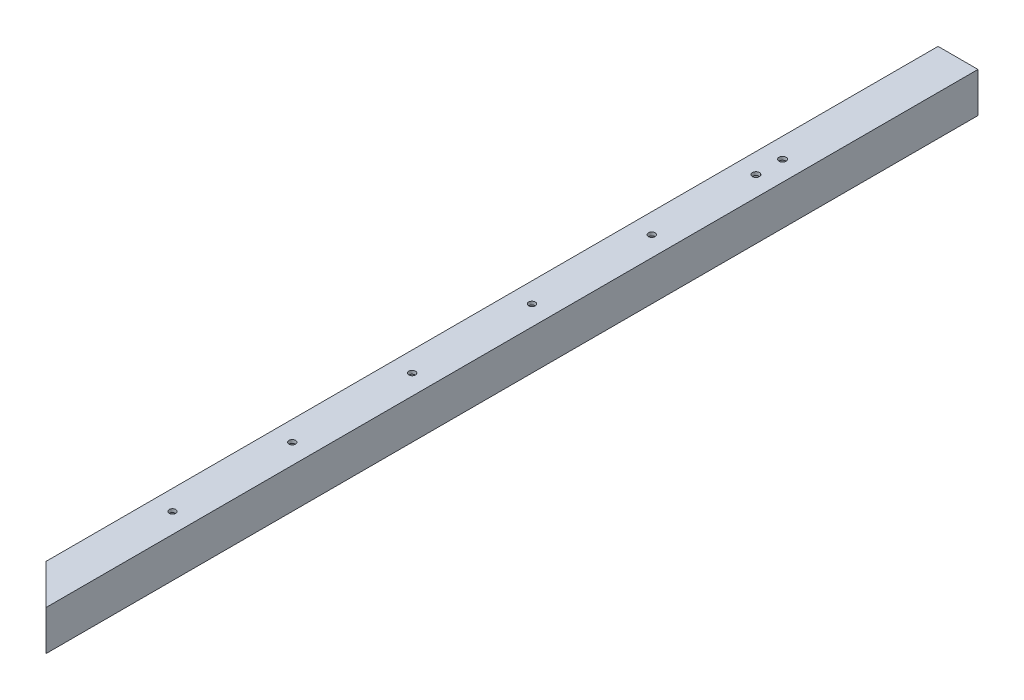
ISO-10303-21;
HEADER;
FILE_DESCRIPTION(('STEP AP214'),'2;1');
FILE_NAME('part.step','',(''),(''),'','','');
FILE_SCHEMA(('AUTOMOTIVE_DESIGN { 1 0 10303 214 1 1 1 1 }'));
ENDSEC;
DATA;
#1=APPLICATION_CONTEXT('core data for automotive mechanical design processes');
#2=APPLICATION_PROTOCOL_DEFINITION('international standard','automotive_design',2000,#1);
#3=PRODUCT_CONTEXT('',#1,'mechanical');
#4=PRODUCT('Part','Part','',(#3));
#5=PRODUCT_RELATED_PRODUCT_CATEGORY('part','',(#4));
#6=PRODUCT_DEFINITION_FORMATION('','',#4);
#7=PRODUCT_DEFINITION_CONTEXT('part definition',#1,'design');
#8=PRODUCT_DEFINITION('design','',#6,#7);
#9=PRODUCT_DEFINITION_SHAPE('','',#8);
#10=(LENGTH_UNIT() NAMED_UNIT(*) SI_UNIT(.MILLI.,.METRE.));
#11=(NAMED_UNIT(*) PLANE_ANGLE_UNIT() SI_UNIT($,.RADIAN.));
#12=(NAMED_UNIT(*) SI_UNIT($,.STERADIAN.) SOLID_ANGLE_UNIT());
#13=UNCERTAINTY_MEASURE_WITH_UNIT(LENGTH_MEASURE(1.E-05),#10,'distance_accuracy_value','');
#14=(GEOMETRIC_REPRESENTATION_CONTEXT(3) GLOBAL_UNCERTAINTY_ASSIGNED_CONTEXT((#13)) GLOBAL_UNIT_ASSIGNED_CONTEXT((#10,
#11,#12)) REPRESENTATION_CONTEXT('',''));
#15=CARTESIAN_POINT('',(0.,0.,0.));
#16=DIRECTION('',(0.,0.,1.));
#17=DIRECTION('',(1.,0.,0.));
#18=AXIS2_PLACEMENT_3D('',#15,#16,#17);
#19=CARTESIAN_POINT('',(7.99360577730113E-13,-887.456360328166,-353.309418015921));
#20=DIRECTION('',(0.,1.,0.));
#21=DIRECTION('',(1.,0.,0.));
#22=AXIS2_PLACEMENT_3D('',#19,#20,#21);
#23=CYLINDRICAL_SURFACE('',#22,3.3782);
#24=CARTESIAN_POINT('',(7.99360577730113E-13,0.,-353.309418015921));
#25=DIRECTION('',(0.,1.,0.));
#26=DIRECTION('',(1.,0.,0.));
#27=AXIS2_PLACEMENT_3D('',#24,#25,#26);
#28=CIRCLE('',#27,3.3782);
#29=CARTESIAN_POINT('',(3.3782000000008,0.,-353.309418015921));
#30=VERTEX_POINT('',#29);
#31=EDGE_CURVE('E100',#30,#30,#28,.T.);
#32=ORIENTED_EDGE('',*,*,#31,.F.);
#33=EDGE_LOOP('',(#32));
#34=FACE_BOUND('',#33,.T.);
#35=CARTESIAN_POINT('',(7.99360577730113E-13,3.17499999999995,-353.309418015921));
#36=DIRECTION('',(0.,-1.,0.));
#37=DIRECTION('',(0.,0.,-1.));
#38=AXIS2_PLACEMENT_3D('',#35,#36,#37);
#39=CIRCLE('',#38,3.3782);
#40=CARTESIAN_POINT('',(7.99360577730113E-13,3.17499999999995,-356.687618015921));
#41=VERTEX_POINT('',#40);
#42=EDGE_CURVE('E185',#41,#41,#39,.T.);
#43=ORIENTED_EDGE('',*,*,#42,.F.);
#44=EDGE_LOOP('',(#43));
#45=FACE_BOUND('',#44,.T.);
#46=ADVANCED_FACE('F16',(#34,#45),#23,.F.);
#47=CARTESIAN_POINT('',(7.99360577730113E-13,-887.456360328166,-327.909418015922));
#48=DIRECTION('',(0.,1.,0.));
#49=DIRECTION('',(1.,0.,0.));
#50=AXIS2_PLACEMENT_3D('',#47,#48,#49);
#51=CYLINDRICAL_SURFACE('',#50,3.3782);
#52=CARTESIAN_POINT('',(7.99360577730113E-13,0.,-327.909418015922));
#53=DIRECTION('',(0.,1.,0.));
#54=DIRECTION('',(1.,0.,0.));
#55=AXIS2_PLACEMENT_3D('',#52,#53,#54);
#56=CIRCLE('',#55,3.3782);
#57=CARTESIAN_POINT('',(3.3782000000008,0.,-327.909418015922));
#58=VERTEX_POINT('',#57);
#59=EDGE_CURVE('E103',#58,#58,#56,.T.);
#60=ORIENTED_EDGE('',*,*,#59,.F.);
#61=EDGE_LOOP('',(#60));
#62=FACE_BOUND('',#61,.T.);
#63=CARTESIAN_POINT('',(7.99360577730113E-13,3.17499999999995,-327.909418015922));
#64=DIRECTION('',(0.,-1.,0.));
#65=DIRECTION('',(0.,0.,-1.));
#66=AXIS2_PLACEMENT_3D('',#63,#64,#65);
#67=CIRCLE('',#66,3.3782);
#68=CARTESIAN_POINT('',(7.99360577730113E-13,3.17499999999995,-331.287618015922));
#69=VERTEX_POINT('',#68);
#70=EDGE_CURVE('E184',#69,#69,#67,.T.);
#71=ORIENTED_EDGE('',*,*,#70,.F.);
#72=EDGE_LOOP('',(#71));
#73=FACE_BOUND('',#72,.T.);
#74=ADVANCED_FACE('F230',(#62,#73),#51,.F.);
#75=CARTESIAN_POINT('',(7.99360577730113E-13,-852.531360328166,-353.309418015921));
#76=DIRECTION('',(0.,1.,0.));
#77=DIRECTION('',(1.,0.,0.));
#78=AXIS2_PLACEMENT_3D('',#75,#76,#77);
#79=CYLINDRICAL_SURFACE('',#78,3.3782);
#80=CARTESIAN_POINT('',(7.99360577730113E-13,34.9250000000001,-353.309418015921));
#81=DIRECTION('',(0.,1.,0.));
#82=DIRECTION('',(1.,0.,0.));
#83=AXIS2_PLACEMENT_3D('',#80,#81,#82);
#84=CIRCLE('',#83,3.3782);
#85=CARTESIAN_POINT('',(3.3782000000008,34.9250000000001,-353.309418015921));
#86=VERTEX_POINT('',#85);
#87=EDGE_CURVE('E176',#86,#86,#84,.T.);
#88=ORIENTED_EDGE('',*,*,#87,.F.);
#89=EDGE_LOOP('',(#88));
#90=FACE_BOUND('',#89,.T.);
#91=CARTESIAN_POINT('',(7.99360577730113E-13,38.1,-353.309418015921));
#92=DIRECTION('',(0.,-1.,0.));
#93=DIRECTION('',(0.,0.,-1.));
#94=AXIS2_PLACEMENT_3D('',#91,#92,#93);
#95=CIRCLE('',#94,3.3782);
#96=CARTESIAN_POINT('',(7.99360577730113E-13,38.1,-356.687618015921));
#97=VERTEX_POINT('',#96);
#98=EDGE_CURVE('E189',#97,#97,#95,.T.);
#99=ORIENTED_EDGE('',*,*,#98,.F.);
#100=EDGE_LOOP('',(#99));
#101=FACE_BOUND('',#100,.T.);
#102=ADVANCED_FACE('F236',(#90,#101),#79,.F.);
#103=CARTESIAN_POINT('',(7.99360577730113E-13,-852.531360328166,-327.909418015922));
#104=DIRECTION('',(0.,1.,0.));
#105=DIRECTION('',(1.,0.,0.));
#106=AXIS2_PLACEMENT_3D('',#103,#104,#105);
#107=CYLINDRICAL_SURFACE('',#106,3.3782);
#108=CARTESIAN_POINT('',(7.99360577730113E-13,34.9250000000001,-327.909418015922));
#109=DIRECTION('',(0.,1.,0.));
#110=DIRECTION('',(1.,0.,0.));
#111=AXIS2_PLACEMENT_3D('',#108,#109,#110);
#112=CIRCLE('',#111,3.3782);
#113=CARTESIAN_POINT('',(3.3782000000008,34.9250000000001,-327.909418015922));
#114=VERTEX_POINT('',#113);
#115=EDGE_CURVE('E95',#114,#114,#112,.T.);
#116=ORIENTED_EDGE('',*,*,#115,.F.);
#117=EDGE_LOOP('',(#116));
#118=FACE_BOUND('',#117,.T.);
#119=CARTESIAN_POINT('',(7.99360577730113E-13,38.1,-327.909418015922));
#120=DIRECTION('',(0.,-1.,0.));
#121=DIRECTION('',(0.,0.,-1.));
#122=AXIS2_PLACEMENT_3D('',#119,#120,#121);
#123=CIRCLE('',#122,3.3782);
#124=CARTESIAN_POINT('',(7.99360577730113E-13,38.1,-331.287618015922));
#125=VERTEX_POINT('',#124);
#126=EDGE_CURVE('E195',#125,#125,#123,.T.);
#127=ORIENTED_EDGE('',*,*,#126,.F.);
#128=EDGE_LOOP('',(#127));
#129=FACE_BOUND('',#128,.T.);
#130=ADVANCED_FACE('F244',(#118,#129),#107,.F.);
#131=CARTESIAN_POINT('',(0.,19.05,-520.7));
#132=DIRECTION('',(0.,0.,1.));
#133=DIRECTION('',(1.,0.,0.));
#134=AXIS2_PLACEMENT_3D('',#131,#132,#133);
#135=PLANE('',#134);
#136=DIRECTION('',(0.,1.,0.));
#137=VECTOR('',#136,1.);
#138=CARTESIAN_POINT('',(15.875,26.9875,-520.7));
#139=LINE('',#138,#137);
#140=CARTESIAN_POINT('',(15.875,3.175,-520.7));
#141=VERTEX_POINT('',#140);
#142=CARTESIAN_POINT('',(15.875,34.925,-520.7));
#143=VERTEX_POINT('',#142);
#144=EDGE_CURVE('E11',#141,#143,#139,.T.);
#145=ORIENTED_EDGE('',*,*,#144,.T.);
#146=DIRECTION('',(-1.,0.,0.));
#147=VECTOR('',#146,1.);
#148=CARTESIAN_POINT('',(-7.9375,34.925,-520.7));
#149=LINE('',#148,#147);
#150=CARTESIAN_POINT('',(-15.875,34.925,-520.7));
#151=VERTEX_POINT('',#150);
#152=EDGE_CURVE('E26',#143,#151,#149,.T.);
#153=ORIENTED_EDGE('',*,*,#152,.T.);
#154=DIRECTION('',(0.,-1.,0.));
#155=VECTOR('',#154,1.);
#156=CARTESIAN_POINT('',(-15.875,11.1125,-520.7));
#157=LINE('',#156,#155);
#158=CARTESIAN_POINT('',(-15.875,3.175,-520.7));
#159=VERTEX_POINT('',#158);
#160=EDGE_CURVE('E456',#151,#159,#157,.T.);
#161=ORIENTED_EDGE('',*,*,#160,.T.);
#162=DIRECTION('',(1.,0.,0.));
#163=VECTOR('',#162,1.);
#164=CARTESIAN_POINT('',(7.9375,3.175,-520.7));
#165=LINE('',#164,#163);
#166=EDGE_CURVE('E453',#159,#141,#165,.T.);
#167=ORIENTED_EDGE('',*,*,#166,.T.);
#168=EDGE_LOOP('',(#145,#153,#161,#167));
#169=FACE_BOUND('',#168,.T.);
#170=DIRECTION('',(-1.,0.,0.));
#171=VECTOR('',#170,1.);
#172=CARTESIAN_POINT('',(19.05,0.,-520.7));
#173=LINE('',#172,#171);
#174=CARTESIAN_POINT('',(19.05,0.,-520.7));
#175=VERTEX_POINT('',#174);
#176=CARTESIAN_POINT('',(-19.05,0.,-520.7));
#177=VERTEX_POINT('',#176);
#178=EDGE_CURVE('E450',#175,#177,#173,.T.);
#179=ORIENTED_EDGE('',*,*,#178,.T.);
#180=DIRECTION('',(0.,1.,0.));
#181=VECTOR('',#180,1.);
#182=CARTESIAN_POINT('',(-19.05,0.,-520.7));
#183=LINE('',#182,#181);
#184=CARTESIAN_POINT('',(-19.05,38.1,-520.7));
#185=VERTEX_POINT('',#184);
#186=EDGE_CURVE('E446',#177,#185,#183,.T.);
#187=ORIENTED_EDGE('',*,*,#186,.T.);
#188=DIRECTION('',(1.,0.,0.));
#189=VECTOR('',#188,1.);
#190=CARTESIAN_POINT('',(-19.05,38.1,-520.7));
#191=LINE('',#190,#189);
#192=CARTESIAN_POINT('',(19.05,38.1,-520.7));
#193=VERTEX_POINT('',#192);
#194=EDGE_CURVE('E451',#185,#193,#191,.T.);
#195=ORIENTED_EDGE('',*,*,#194,.T.);
#196=DIRECTION('',(0.,-1.,0.));
#197=VECTOR('',#196,1.);
#198=CARTESIAN_POINT('',(19.05,38.1,-520.7));
#199=LINE('',#198,#197);
#200=EDGE_CURVE('E170',#193,#175,#199,.T.);
#201=ORIENTED_EDGE('',*,*,#200,.T.);
#202=EDGE_LOOP('',(#179,#187,#195,#201));
#203=FACE_BOUND('',#202,.T.);
#204=ADVANCED_FACE('F248',(#169,#203),#135,.F.);
#205=CARTESIAN_POINT('',(19.05,-0.00100000000000211,368.3));
#206=DIRECTION('',(0.707106781176342,0.,-0.707106781196753));
#207=DIRECTION('',(-0.707106781196753,0.,-0.707106781176342));
#208=AXIS2_PLACEMENT_3D('',#205,#206,#207);
#209=PLANE('',#208);
#210=DIRECTION('',(0.,-1.,0.));
#211=VECTOR('',#210,1.);
#212=CARTESIAN_POINT('',(19.05,-0.000500000000001055,368.3));
#213=LINE('',#212,#211);
#214=CARTESIAN_POINT('',(19.05,38.1,368.3));
#215=VERTEX_POINT('',#214);
#216=CARTESIAN_POINT('',(19.05,0.,368.3));
#217=VERTEX_POINT('',#216);
#218=EDGE_CURVE('E159',#215,#217,#213,.T.);
#219=ORIENTED_EDGE('',*,*,#218,.F.);
#220=DIRECTION('',(0.707106781196753,0.,0.707106781176342));
#221=VECTOR('',#220,1.);
#222=CARTESIAN_POINT('',(-77.7875000001375,38.1,271.462500002658));
#223=LINE('',#222,#221);
#224=CARTESIAN_POINT('',(-19.05,38.1,330.2000000011));
#225=VERTEX_POINT('',#224);
#226=EDGE_CURVE('E172',#225,#215,#223,.T.);
#227=ORIENTED_EDGE('',*,*,#226,.F.);
#228=DIRECTION('',(0.,1.,0.));
#229=VECTOR('',#228,1.);
#230=CARTESIAN_POINT('',(-19.05,-0.000500000000001055,330.2000000011));
#231=LINE('',#230,#229);
#232=CARTESIAN_POINT('',(-19.05,0.,330.2000000011));
#233=VERTEX_POINT('',#232);
#234=EDGE_CURVE('E177',#233,#225,#231,.T.);
#235=ORIENTED_EDGE('',*,*,#234,.F.);
#236=DIRECTION('',(-0.707106781196753,0.,-0.707106781176342));
#237=VECTOR('',#236,1.);
#238=CARTESIAN_POINT('',(-77.7875000001375,0.,271.462500002658));
#239=LINE('',#238,#237);
#240=EDGE_CURVE('E181',#217,#233,#239,.T.);
#241=ORIENTED_EDGE('',*,*,#240,.F.);
#242=EDGE_LOOP('',(#219,#227,#235,#241));
#243=FACE_BOUND('',#242,.T.);
#244=DIRECTION('',(0.707106781196753,0.,0.707106781176342));
#245=VECTOR('',#244,1.);
#246=CARTESIAN_POINT('',(-77.7875000001375,3.175,271.462500002658));
#247=LINE('',#246,#245);
#248=CARTESIAN_POINT('',(-15.875,3.175,333.375000001008));
#249=VERTEX_POINT('',#248);
#250=CARTESIAN_POINT('',(15.875,3.175,365.125000000092));
#251=VERTEX_POINT('',#250);
#252=EDGE_CURVE('E128',#249,#251,#247,.T.);
#253=ORIENTED_EDGE('',*,*,#252,.F.);
#254=DIRECTION('',(0.,-1.,0.));
#255=VECTOR('',#254,1.);
#256=CARTESIAN_POINT('',(-15.875,-0.000500000000001055,333.375000001008));
#257=LINE('',#256,#255);
#258=CARTESIAN_POINT('',(-15.875,34.925,333.375000001008));
#259=VERTEX_POINT('',#258);
#260=EDGE_CURVE('E77',#259,#249,#257,.T.);
#261=ORIENTED_EDGE('',*,*,#260,.F.);
#262=DIRECTION('',(-0.707106781196753,0.,-0.707106781176342));
#263=VECTOR('',#262,1.);
#264=CARTESIAN_POINT('',(-77.7875000001375,34.925,271.462500002658));
#265=LINE('',#264,#263);
#266=CARTESIAN_POINT('',(15.875,34.925,365.125000000092));
#267=VERTEX_POINT('',#266);
#268=EDGE_CURVE('E92',#267,#259,#265,.T.);
#269=ORIENTED_EDGE('',*,*,#268,.F.);
#270=DIRECTION('',(0.,1.,0.));
#271=VECTOR('',#270,1.);
#272=CARTESIAN_POINT('',(15.875,-0.000500000000001055,365.125000000092));
#273=LINE('',#272,#271);
#274=EDGE_CURVE('E83',#251,#267,#273,.T.);
#275=ORIENTED_EDGE('',*,*,#274,.F.);
#276=EDGE_LOOP('',(#253,#261,#269,#275));
#277=FACE_BOUND('',#276,.T.);
#278=ADVANCED_FACE('F93',(#243,#277),#209,.F.);
#279=CARTESIAN_POINT('',(-19.05,0.,-241.3));
#280=DIRECTION('',(-1.,0.,0.));
#281=DIRECTION('',(0.,0.,1.));
#282=AXIS2_PLACEMENT_3D('',#279,#280,#281);
#283=PLANE('',#282);
#284=ORIENTED_EDGE('',*,*,#234,.T.);
#285=DIRECTION('',(0.,0.,-1.));
#286=VECTOR('',#285,1.);
#287=CARTESIAN_POINT('',(-19.05,38.1,-241.3));
#288=LINE('',#287,#286);
#289=EDGE_CURVE('E180',#225,#185,#288,.T.);
#290=ORIENTED_EDGE('',*,*,#289,.T.);
#291=ORIENTED_EDGE('',*,*,#186,.F.);
#292=DIRECTION('',(0.,0.,-1.));
#293=VECTOR('',#292,1.);
#294=CARTESIAN_POINT('',(-19.05,0.,241.3));
#295=LINE('',#294,#293);
#296=EDGE_CURVE('E145',#233,#177,#295,.T.);
#297=ORIENTED_EDGE('',*,*,#296,.F.);
#298=EDGE_LOOP('',(#284,#290,#291,#297));
#299=FACE_BOUND('',#298,.T.);
#300=ADVANCED_FACE('F255',(#299),#283,.T.);
#301=CARTESIAN_POINT('',(0.,38.1,0.));
#302=DIRECTION('',(0.,1.,0.));
#303=DIRECTION('',(0.,0.,1.));
#304=AXIS2_PLACEMENT_3D('',#301,#302,#303);
#305=PLANE('',#304);
#306=ORIENTED_EDGE('',*,*,#98,.T.);
#307=EDGE_LOOP('',(#306));
#308=FACE_BOUND('',#307,.T.);
#309=ORIENTED_EDGE('',*,*,#126,.T.);
#310=EDGE_LOOP('',(#309));
#311=FACE_BOUND('',#310,.T.);
#312=CARTESIAN_POINT('',(0.,38.1,-228.6));
#313=DIRECTION('',(0.,-1.,0.));
#314=DIRECTION('',(0.,0.,-1.));
#315=AXIS2_PLACEMENT_3D('',#312,#313,#314);
#316=CIRCLE('',#315,3.175);
#317=CARTESIAN_POINT('',(0.,38.1,-231.775));
#318=VERTEX_POINT('',#317);
#319=EDGE_CURVE('E192',#318,#318,#316,.T.);
#320=ORIENTED_EDGE('',*,*,#319,.T.);
#321=EDGE_LOOP('',(#320));
#322=FACE_BOUND('',#321,.T.);
#323=CARTESIAN_POINT('',(0.,38.1,-114.3));
#324=DIRECTION('',(0.,-1.,0.));
#325=DIRECTION('',(0.,0.,-1.));
#326=AXIS2_PLACEMENT_3D('',#323,#324,#325);
#327=CIRCLE('',#326,3.175);
#328=CARTESIAN_POINT('',(0.,38.1,-117.475));
#329=VERTEX_POINT('',#328);
#330=EDGE_CURVE('E196',#329,#329,#327,.T.);
#331=ORIENTED_EDGE('',*,*,#330,.T.);
#332=EDGE_LOOP('',(#331));
#333=FACE_BOUND('',#332,.T.);
#334=CARTESIAN_POINT('',(0.,38.1,0.));
#335=DIRECTION('',(0.,-1.,0.));
#336=DIRECTION('',(0.,0.,-1.));
#337=AXIS2_PLACEMENT_3D('',#334,#335,#336);
#338=CIRCLE('',#337,3.175);
#339=CARTESIAN_POINT('',(0.,38.1,-3.175));
#340=VERTEX_POINT('',#339);
#341=EDGE_CURVE('E199',#340,#340,#338,.T.);
#342=ORIENTED_EDGE('',*,*,#341,.T.);
#343=EDGE_LOOP('',(#342));
#344=FACE_BOUND('',#343,.T.);
#345=CARTESIAN_POINT('',(0.,38.1,114.3));
#346=DIRECTION('',(0.,-1.,0.));
#347=DIRECTION('',(0.,0.,-1.));
#348=AXIS2_PLACEMENT_3D('',#345,#346,#347);
#349=CIRCLE('',#348,3.175);
#350=CARTESIAN_POINT('',(0.,38.1,111.125));
#351=VERTEX_POINT('',#350);
#352=EDGE_CURVE('E202',#351,#351,#349,.T.);
#353=ORIENTED_EDGE('',*,*,#352,.T.);
#354=EDGE_LOOP('',(#353));
#355=FACE_BOUND('',#354,.T.);
#356=CARTESIAN_POINT('',(0.,38.1,228.6));
#357=DIRECTION('',(0.,-1.,0.));
#358=DIRECTION('',(0.,0.,-1.));
#359=AXIS2_PLACEMENT_3D('',#356,#357,#358);
#360=CIRCLE('',#359,3.175);
#361=CARTESIAN_POINT('',(0.,38.1,225.425));
#362=VERTEX_POINT('',#361);
#363=EDGE_CURVE('E175',#362,#362,#360,.T.);
#364=ORIENTED_EDGE('',*,*,#363,.T.);
#365=EDGE_LOOP('',(#364));
#366=FACE_BOUND('',#365,.T.);
#367=ORIENTED_EDGE('',*,*,#226,.T.);
#368=DIRECTION('',(0.,0.,1.));
#369=VECTOR('',#368,1.);
#370=CARTESIAN_POINT('',(19.05,38.1,241.3));
#371=LINE('',#370,#369);
#372=EDGE_CURVE('E162',#193,#215,#371,.T.);
#373=ORIENTED_EDGE('',*,*,#372,.F.);
#374=ORIENTED_EDGE('',*,*,#194,.F.);
#375=ORIENTED_EDGE('',*,*,#289,.F.);
#376=EDGE_LOOP('',(#367,#373,#374,#375));
#377=FACE_BOUND('',#376,.T.);
#378=ADVANCED_FACE('F208',(#308,#311,#322,#333,#344,#355,#366,#377),#305,.T.);
#379=CARTESIAN_POINT('',(0.,34.925,0.));
#380=DIRECTION('',(0.,1.,0.));
#381=DIRECTION('',(0.,0.,1.));
#382=AXIS2_PLACEMENT_3D('',#379,#380,#381);
#383=PLANE('',#382);
#384=ORIENTED_EDGE('',*,*,#87,.T.);
#385=EDGE_LOOP('',(#384));
#386=FACE_BOUND('',#385,.T.);
#387=ORIENTED_EDGE('',*,*,#115,.T.);
#388=EDGE_LOOP('',(#387));
#389=FACE_BOUND('',#388,.T.);
#390=ORIENTED_EDGE('',*,*,#268,.T.);
#391=DIRECTION('',(0.,0.,-1.));
#392=VECTOR('',#391,1.);
#393=CARTESIAN_POINT('',(-15.875,34.925,-241.3));
#394=LINE('',#393,#392);
#395=EDGE_CURVE('E96',#259,#151,#394,.T.);
#396=ORIENTED_EDGE('',*,*,#395,.T.);
#397=ORIENTED_EDGE('',*,*,#152,.F.);
#398=DIRECTION('',(0.,0.,-1.));
#399=VECTOR('',#398,1.);
#400=CARTESIAN_POINT('',(15.875,34.925,-241.3));
#401=LINE('',#400,#399);
#402=EDGE_CURVE('E86',#267,#143,#401,.T.);
#403=ORIENTED_EDGE('',*,*,#402,.F.);
#404=EDGE_LOOP('',(#390,#396,#397,#403));
#405=FACE_BOUND('',#404,.T.);
#406=CARTESIAN_POINT('',(0.,34.925,228.6));
#407=DIRECTION('',(0.,1.,0.));
#408=DIRECTION('',(1.,0.,0.));
#409=AXIS2_PLACEMENT_3D('',#406,#407,#408);
#410=CIRCLE('',#409,3.175);
#411=CARTESIAN_POINT('',(3.175,34.925,228.6));
#412=VERTEX_POINT('',#411);
#413=EDGE_CURVE('E108',#412,#412,#410,.T.);
#414=ORIENTED_EDGE('',*,*,#413,.T.);
#415=EDGE_LOOP('',(#414));
#416=FACE_BOUND('',#415,.T.);
#417=CARTESIAN_POINT('',(0.,34.925,114.3));
#418=DIRECTION('',(0.,1.,0.));
#419=DIRECTION('',(1.,0.,0.));
#420=AXIS2_PLACEMENT_3D('',#417,#418,#419);
#421=CIRCLE('',#420,3.175);
#422=CARTESIAN_POINT('',(3.175,34.925,114.3));
#423=VERTEX_POINT('',#422);
#424=EDGE_CURVE('E111',#423,#423,#421,.T.);
#425=ORIENTED_EDGE('',*,*,#424,.T.);
#426=EDGE_LOOP('',(#425));
#427=FACE_BOUND('',#426,.T.);
#428=CARTESIAN_POINT('',(0.,34.925,0.));
#429=DIRECTION('',(0.,1.,0.));
#430=DIRECTION('',(1.,0.,0.));
#431=AXIS2_PLACEMENT_3D('',#428,#429,#430);
#432=CIRCLE('',#431,3.175);
#433=CARTESIAN_POINT('',(3.175,34.925,0.));
#434=VERTEX_POINT('',#433);
#435=EDGE_CURVE('E114',#434,#434,#432,.T.);
#436=ORIENTED_EDGE('',*,*,#435,.T.);
#437=EDGE_LOOP('',(#436));
#438=FACE_BOUND('',#437,.T.);
#439=CARTESIAN_POINT('',(0.,34.925,-114.3));
#440=DIRECTION('',(0.,1.,0.));
#441=DIRECTION('',(1.,0.,0.));
#442=AXIS2_PLACEMENT_3D('',#439,#440,#441);
#443=CIRCLE('',#442,3.175);
#444=CARTESIAN_POINT('',(3.175,34.925,-114.3));
#445=VERTEX_POINT('',#444);
#446=EDGE_CURVE('E117',#445,#445,#443,.T.);
#447=ORIENTED_EDGE('',*,*,#446,.T.);
#448=EDGE_LOOP('',(#447));
#449=FACE_BOUND('',#448,.T.);
#450=CARTESIAN_POINT('',(0.,34.925,-228.6));
#451=DIRECTION('',(0.,1.,0.));
#452=DIRECTION('',(1.,0.,0.));
#453=AXIS2_PLACEMENT_3D('',#450,#451,#452);
#454=CIRCLE('',#453,3.175);
#455=CARTESIAN_POINT('',(3.175,34.925,-228.6));
#456=VERTEX_POINT('',#455);
#457=EDGE_CURVE('E120',#456,#456,#454,.T.);
#458=ORIENTED_EDGE('',*,*,#457,.T.);
#459=EDGE_LOOP('',(#458));
#460=FACE_BOUND('',#459,.T.);
#461=ADVANCED_FACE('F98',(#386,#389,#405,#416,#427,#438,#449,#460),#383,.F.);
#462=CARTESIAN_POINT('',(-15.875,0.,-241.3));
#463=DIRECTION('',(-1.,0.,0.));
#464=DIRECTION('',(0.,0.,1.));
#465=AXIS2_PLACEMENT_3D('',#462,#463,#464);
#466=PLANE('',#465);
#467=ORIENTED_EDGE('',*,*,#260,.T.);
#468=DIRECTION('',(0.,0.,1.));
#469=VECTOR('',#468,1.);
#470=CARTESIAN_POINT('',(-15.875,3.175,241.3));
#471=LINE('',#470,#469);
#472=EDGE_CURVE('E123',#159,#249,#471,.T.);
#473=ORIENTED_EDGE('',*,*,#472,.F.);
#474=ORIENTED_EDGE('',*,*,#160,.F.);
#475=ORIENTED_EDGE('',*,*,#395,.F.);
#476=EDGE_LOOP('',(#467,#473,#474,#475));
#477=FACE_BOUND('',#476,.T.);
#478=ADVANCED_FACE('F265',(#477),#466,.F.);
#479=CARTESIAN_POINT('',(0.,3.175,0.));
#480=DIRECTION('',(0.,1.,0.));
#481=DIRECTION('',(0.,0.,1.));
#482=AXIS2_PLACEMENT_3D('',#479,#480,#481);
#483=PLANE('',#482);
#484=ORIENTED_EDGE('',*,*,#42,.T.);
#485=EDGE_LOOP('',(#484));
#486=FACE_BOUND('',#485,.T.);
#487=ORIENTED_EDGE('',*,*,#70,.T.);
#488=EDGE_LOOP('',(#487));
#489=FACE_BOUND('',#488,.T.);
#490=ORIENTED_EDGE('',*,*,#252,.T.);
#491=DIRECTION('',(0.,0.,-1.));
#492=VECTOR('',#491,1.);
#493=CARTESIAN_POINT('',(15.875,3.175,-241.3));
#494=LINE('',#493,#492);
#495=EDGE_CURVE('E88',#251,#141,#494,.T.);
#496=ORIENTED_EDGE('',*,*,#495,.T.);
#497=ORIENTED_EDGE('',*,*,#166,.F.);
#498=ORIENTED_EDGE('',*,*,#472,.T.);
#499=EDGE_LOOP('',(#490,#496,#497,#498));
#500=FACE_BOUND('',#499,.T.);
#501=CARTESIAN_POINT('',(0.,3.17500000000003,228.6));
#502=DIRECTION('',(0.,-1.,0.));
#503=DIRECTION('',(0.,0.,-1.));
#504=AXIS2_PLACEMENT_3D('',#501,#502,#503);
#505=CIRCLE('',#504,3.175);
#506=CARTESIAN_POINT('',(0.,3.17500000000003,225.425));
#507=VERTEX_POINT('',#506);
#508=EDGE_CURVE('E126',#507,#507,#505,.T.);
#509=ORIENTED_EDGE('',*,*,#508,.T.);
#510=EDGE_LOOP('',(#509));
#511=FACE_BOUND('',#510,.T.);
#512=CARTESIAN_POINT('',(0.,3.17500000000003,114.3));
#513=DIRECTION('',(0.,-1.,0.));
#514=DIRECTION('',(0.,0.,-1.));
#515=AXIS2_PLACEMENT_3D('',#512,#513,#514);
#516=CIRCLE('',#515,3.175);
#517=CARTESIAN_POINT('',(0.,3.17500000000003,111.125));
#518=VERTEX_POINT('',#517);
#519=EDGE_CURVE('E131',#518,#518,#516,.T.);
#520=ORIENTED_EDGE('',*,*,#519,.T.);
#521=EDGE_LOOP('',(#520));
#522=FACE_BOUND('',#521,.T.);
#523=CARTESIAN_POINT('',(0.,3.17500000000003,0.));
#524=DIRECTION('',(0.,-1.,0.));
#525=DIRECTION('',(0.,0.,-1.));
#526=AXIS2_PLACEMENT_3D('',#523,#524,#525);
#527=CIRCLE('',#526,3.175);
#528=CARTESIAN_POINT('',(0.,3.17500000000003,-3.175));
#529=VERTEX_POINT('',#528);
#530=EDGE_CURVE('E134',#529,#529,#527,.T.);
#531=ORIENTED_EDGE('',*,*,#530,.T.);
#532=EDGE_LOOP('',(#531));
#533=FACE_BOUND('',#532,.T.);
#534=CARTESIAN_POINT('',(0.,3.17500000000003,-114.3));
#535=DIRECTION('',(0.,-1.,0.));
#536=DIRECTION('',(0.,0.,-1.));
#537=AXIS2_PLACEMENT_3D('',#534,#535,#536);
#538=CIRCLE('',#537,3.175);
#539=CARTESIAN_POINT('',(0.,3.17500000000003,-117.475));
#540=VERTEX_POINT('',#539);
#541=EDGE_CURVE('E137',#540,#540,#538,.T.);
#542=ORIENTED_EDGE('',*,*,#541,.T.);
#543=EDGE_LOOP('',(#542));
#544=FACE_BOUND('',#543,.T.);
#545=CARTESIAN_POINT('',(0.,3.17500000000003,-228.6));
#546=DIRECTION('',(0.,-1.,0.));
#547=DIRECTION('',(0.,0.,-1.));
#548=AXIS2_PLACEMENT_3D('',#545,#546,#547);
#549=CIRCLE('',#548,3.175);
#550=CARTESIAN_POINT('',(0.,3.17500000000003,-231.775));
#551=VERTEX_POINT('',#550);
#552=EDGE_CURVE('E90',#551,#551,#549,.T.);
#553=ORIENTED_EDGE('',*,*,#552,.T.);
#554=EDGE_LOOP('',(#553));
#555=FACE_BOUND('',#554,.T.);
#556=ADVANCED_FACE('F269',(#486,#489,#500,#511,#522,#533,#544,#555),#483,.T.);
#557=CARTESIAN_POINT('',(15.875,0.,241.3));
#558=DIRECTION('',(1.,0.,0.));
#559=DIRECTION('',(0.,0.,-1.));
#560=AXIS2_PLACEMENT_3D('',#557,#558,#559);
#561=PLANE('',#560);
#562=ORIENTED_EDGE('',*,*,#274,.T.);
#563=ORIENTED_EDGE('',*,*,#402,.T.);
#564=ORIENTED_EDGE('',*,*,#144,.F.);
#565=ORIENTED_EDGE('',*,*,#495,.F.);
#566=EDGE_LOOP('',(#562,#563,#564,#565));
#567=FACE_BOUND('',#566,.T.);
#568=ADVANCED_FACE('F84',(#567),#561,.F.);
#569=CARTESIAN_POINT('',(0.,0.,0.));
#570=DIRECTION('',(0.,1.,0.));
#571=DIRECTION('',(0.,0.,1.));
#572=AXIS2_PLACEMENT_3D('',#569,#570,#571);
#573=PLANE('',#572);
#574=ORIENTED_EDGE('',*,*,#31,.T.);
#575=EDGE_LOOP('',(#574));
#576=FACE_BOUND('',#575,.T.);
#577=ORIENTED_EDGE('',*,*,#59,.T.);
#578=EDGE_LOOP('',(#577));
#579=FACE_BOUND('',#578,.T.);
#580=ORIENTED_EDGE('',*,*,#240,.T.);
#581=ORIENTED_EDGE('',*,*,#296,.T.);
#582=ORIENTED_EDGE('',*,*,#178,.F.);
#583=DIRECTION('',(0.,0.,1.));
#584=VECTOR('',#583,1.);
#585=CARTESIAN_POINT('',(19.05,0.,241.3));
#586=LINE('',#585,#584);
#587=EDGE_CURVE('E142',#175,#217,#586,.T.);
#588=ORIENTED_EDGE('',*,*,#587,.T.);
#589=EDGE_LOOP('',(#580,#581,#582,#588));
#590=FACE_BOUND('',#589,.T.);
#591=CARTESIAN_POINT('',(0.,0.,-228.6));
#592=DIRECTION('',(0.,1.,0.));
#593=DIRECTION('',(1.,0.,0.));
#594=AXIS2_PLACEMENT_3D('',#591,#592,#593);
#595=CIRCLE('',#594,3.175);
#596=CARTESIAN_POINT('',(3.175,0.,-228.6));
#597=VERTEX_POINT('',#596);
#598=EDGE_CURVE('E146',#597,#597,#595,.T.);
#599=ORIENTED_EDGE('',*,*,#598,.T.);
#600=EDGE_LOOP('',(#599));
#601=FACE_BOUND('',#600,.T.);
#602=CARTESIAN_POINT('',(0.,0.,-114.3));
#603=DIRECTION('',(0.,1.,0.));
#604=DIRECTION('',(1.,0.,0.));
#605=AXIS2_PLACEMENT_3D('',#602,#603,#604);
#606=CIRCLE('',#605,3.175);
#607=CARTESIAN_POINT('',(3.175,0.,-114.3));
#608=VERTEX_POINT('',#607);
#609=EDGE_CURVE('E149',#608,#608,#606,.T.);
#610=ORIENTED_EDGE('',*,*,#609,.T.);
#611=EDGE_LOOP('',(#610));
#612=FACE_BOUND('',#611,.T.);
#613=CARTESIAN_POINT('',(0.,0.,0.));
#614=DIRECTION('',(0.,1.,0.));
#615=DIRECTION('',(1.,0.,0.));
#616=AXIS2_PLACEMENT_3D('',#613,#614,#615);
#617=CIRCLE('',#616,3.175);
#618=CARTESIAN_POINT('',(3.175,0.,0.));
#619=VERTEX_POINT('',#618);
#620=EDGE_CURVE('E152',#619,#619,#617,.T.);
#621=ORIENTED_EDGE('',*,*,#620,.T.);
#622=EDGE_LOOP('',(#621));
#623=FACE_BOUND('',#622,.T.);
#624=CARTESIAN_POINT('',(0.,0.,114.3));
#625=DIRECTION('',(0.,1.,0.));
#626=DIRECTION('',(1.,0.,0.));
#627=AXIS2_PLACEMENT_3D('',#624,#625,#626);
#628=CIRCLE('',#627,3.175);
#629=CARTESIAN_POINT('',(3.175,0.,114.3));
#630=VERTEX_POINT('',#629);
#631=EDGE_CURVE('E154',#630,#630,#628,.T.);
#632=ORIENTED_EDGE('',*,*,#631,.T.);
#633=EDGE_LOOP('',(#632));
#634=FACE_BOUND('',#633,.T.);
#635=CARTESIAN_POINT('',(0.,0.,228.6));
#636=DIRECTION('',(0.,1.,0.));
#637=DIRECTION('',(1.,0.,0.));
#638=AXIS2_PLACEMENT_3D('',#635,#636,#637);
#639=CIRCLE('',#638,3.175);
#640=CARTESIAN_POINT('',(3.175,0.,228.6));
#641=VERTEX_POINT('',#640);
#642=EDGE_CURVE('E20',#641,#641,#639,.T.);
#643=ORIENTED_EDGE('',*,*,#642,.T.);
#644=EDGE_LOOP('',(#643));
#645=FACE_BOUND('',#644,.T.);
#646=ADVANCED_FACE('F225',(#576,#579,#590,#601,#612,#623,#634,#645),#573,.F.);
#647=CARTESIAN_POINT('',(0.,-447.498579075351,228.6));
#648=DIRECTION('',(0.,1.,0.));
#649=DIRECTION('',(1.,0.,0.));
#650=AXIS2_PLACEMENT_3D('',#647,#648,#649);
#651=CYLINDRICAL_SURFACE('',#650,3.175);
#652=ORIENTED_EDGE('',*,*,#642,.F.);
#653=EDGE_LOOP('',(#652));
#654=FACE_BOUND('',#653,.T.);
#655=ORIENTED_EDGE('',*,*,#508,.F.);
#656=EDGE_LOOP('',(#655));
#657=FACE_BOUND('',#656,.T.);
#658=ADVANCED_FACE('F214',(#654,#657),#651,.F.);
#659=CARTESIAN_POINT('',(0.,-447.498579075351,228.6));
#660=DIRECTION('',(0.,1.,0.));
#661=DIRECTION('',(1.,0.,0.));
#662=AXIS2_PLACEMENT_3D('',#659,#660,#661);
#663=CYLINDRICAL_SURFACE('',#662,3.175);
#664=ORIENTED_EDGE('',*,*,#413,.F.);
#665=EDGE_LOOP('',(#664));
#666=FACE_BOUND('',#665,.T.);
#667=ORIENTED_EDGE('',*,*,#363,.F.);
#668=EDGE_LOOP('',(#667));
#669=FACE_BOUND('',#668,.T.);
#670=ADVANCED_FACE('F211',(#666,#669),#663,.F.);
#671=CARTESIAN_POINT('',(0.,-447.498579075351,114.3));
#672=DIRECTION('',(0.,1.,0.));
#673=DIRECTION('',(1.,0.,0.));
#674=AXIS2_PLACEMENT_3D('',#671,#672,#673);
#675=CYLINDRICAL_SURFACE('',#674,3.175);
#676=ORIENTED_EDGE('',*,*,#631,.F.);
#677=EDGE_LOOP('',(#676));
#678=FACE_BOUND('',#677,.T.);
#679=ORIENTED_EDGE('',*,*,#519,.F.);
#680=EDGE_LOOP('',(#679));
#681=FACE_BOUND('',#680,.T.);
#682=ADVANCED_FACE('F213',(#678,#681),#675,.F.);
#683=CARTESIAN_POINT('',(0.,-447.498579075351,114.3));
#684=DIRECTION('',(0.,1.,0.));
#685=DIRECTION('',(1.,0.,0.));
#686=AXIS2_PLACEMENT_3D('',#683,#684,#685);
#687=CYLINDRICAL_SURFACE('',#686,3.175);
#688=ORIENTED_EDGE('',*,*,#424,.F.);
#689=EDGE_LOOP('',(#688));
#690=FACE_BOUND('',#689,.T.);
#691=ORIENTED_EDGE('',*,*,#352,.F.);
#692=EDGE_LOOP('',(#691));
#693=FACE_BOUND('',#692,.T.);
#694=ADVANCED_FACE('F222',(#690,#693),#687,.F.);
#695=CARTESIAN_POINT('',(0.,-447.498579075351,0.));
#696=DIRECTION('',(0.,1.,0.));
#697=DIRECTION('',(1.,0.,0.));
#698=AXIS2_PLACEMENT_3D('',#695,#696,#697);
#699=CYLINDRICAL_SURFACE('',#698,3.175);
#700=ORIENTED_EDGE('',*,*,#620,.F.);
#701=EDGE_LOOP('',(#700));
#702=FACE_BOUND('',#701,.T.);
#703=ORIENTED_EDGE('',*,*,#530,.F.);
#704=EDGE_LOOP('',(#703));
#705=FACE_BOUND('',#704,.T.);
#706=ADVANCED_FACE('F292',(#702,#705),#699,.F.);
#707=CARTESIAN_POINT('',(0.,-447.498579075351,0.));
#708=DIRECTION('',(0.,1.,0.));
#709=DIRECTION('',(1.,0.,0.));
#710=AXIS2_PLACEMENT_3D('',#707,#708,#709);
#711=CYLINDRICAL_SURFACE('',#710,3.175);
#712=ORIENTED_EDGE('',*,*,#435,.F.);
#713=EDGE_LOOP('',(#712));
#714=FACE_BOUND('',#713,.T.);
#715=ORIENTED_EDGE('',*,*,#341,.F.);
#716=EDGE_LOOP('',(#715));
#717=FACE_BOUND('',#716,.T.);
#718=ADVANCED_FACE('F295',(#714,#717),#711,.F.);
#719=CARTESIAN_POINT('',(0.,-447.498579075351,-114.3));
#720=DIRECTION('',(0.,1.,0.));
#721=DIRECTION('',(1.,0.,0.));
#722=AXIS2_PLACEMENT_3D('',#719,#720,#721);
#723=CYLINDRICAL_SURFACE('',#722,3.175);
#724=ORIENTED_EDGE('',*,*,#609,.F.);
#725=EDGE_LOOP('',(#724));
#726=FACE_BOUND('',#725,.T.);
#727=ORIENTED_EDGE('',*,*,#541,.F.);
#728=EDGE_LOOP('',(#727));
#729=FACE_BOUND('',#728,.T.);
#730=ADVANCED_FACE('F315',(#726,#729),#723,.F.);
#731=CARTESIAN_POINT('',(0.,-447.498579075351,-114.3));
#732=DIRECTION('',(0.,1.,0.));
#733=DIRECTION('',(1.,0.,0.));
#734=AXIS2_PLACEMENT_3D('',#731,#732,#733);
#735=CYLINDRICAL_SURFACE('',#734,3.175);
#736=ORIENTED_EDGE('',*,*,#446,.F.);
#737=EDGE_LOOP('',(#736));
#738=FACE_BOUND('',#737,.T.);
#739=ORIENTED_EDGE('',*,*,#330,.F.);
#740=EDGE_LOOP('',(#739));
#741=FACE_BOUND('',#740,.T.);
#742=ADVANCED_FACE('F307',(#738,#741),#735,.F.);
#743=CARTESIAN_POINT('',(0.,-447.498579075351,-228.6));
#744=DIRECTION('',(0.,1.,0.));
#745=DIRECTION('',(1.,0.,0.));
#746=AXIS2_PLACEMENT_3D('',#743,#744,#745);
#747=CYLINDRICAL_SURFACE('',#746,3.175);
#748=ORIENTED_EDGE('',*,*,#598,.F.);
#749=EDGE_LOOP('',(#748));
#750=FACE_BOUND('',#749,.T.);
#751=ORIENTED_EDGE('',*,*,#552,.F.);
#752=EDGE_LOOP('',(#751));
#753=FACE_BOUND('',#752,.T.);
#754=ADVANCED_FACE('F304',(#750,#753),#747,.F.);
#755=CARTESIAN_POINT('',(0.,-447.498579075351,-228.6));
#756=DIRECTION('',(0.,1.,0.));
#757=DIRECTION('',(1.,0.,0.));
#758=AXIS2_PLACEMENT_3D('',#755,#756,#757);
#759=CYLINDRICAL_SURFACE('',#758,3.175);
#760=ORIENTED_EDGE('',*,*,#457,.F.);
#761=EDGE_LOOP('',(#760));
#762=FACE_BOUND('',#761,.T.);
#763=ORIENTED_EDGE('',*,*,#319,.F.);
#764=EDGE_LOOP('',(#763));
#765=FACE_BOUND('',#764,.T.);
#766=ADVANCED_FACE('F306',(#762,#765),#759,.F.);
#767=CARTESIAN_POINT('',(19.05,0.,241.3));
#768=DIRECTION('',(1.,0.,0.));
#769=DIRECTION('',(0.,0.,-1.));
#770=AXIS2_PLACEMENT_3D('',#767,#768,#769);
#771=PLANE('',#770);
#772=ORIENTED_EDGE('',*,*,#218,.T.);
#773=ORIENTED_EDGE('',*,*,#587,.F.);
#774=ORIENTED_EDGE('',*,*,#200,.F.);
#775=ORIENTED_EDGE('',*,*,#372,.T.);
#776=EDGE_LOOP('',(#772,#773,#774,#775));
#777=FACE_BOUND('',#776,.T.);
#778=ADVANCED_FACE('F18',(#777),#771,.T.);
#779=CLOSED_SHELL('',(#46,#74,#102,#130,#204,#278,#300,#378,#461,#478,#556,#568,#646,#658,#670,
#682,#694,#706,#718,#730,#742,#754,#766,#778));
#780=MANIFOLD_SOLID_BREP('B1',#779);
#781=ADVANCED_BREP_SHAPE_REPRESENTATION('',(#18,#780),#14);
#782=SHAPE_DEFINITION_REPRESENTATION(#9,#781);
ENDSEC;
END-ISO-10303-21;
